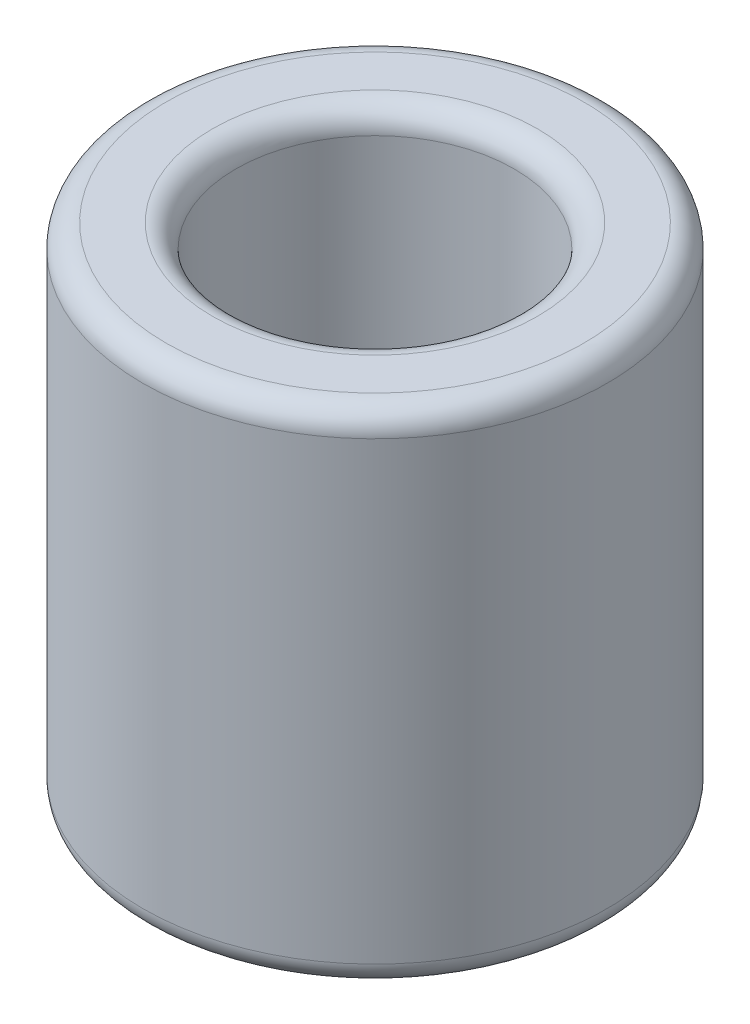
ISO-10303-21;
HEADER;
FILE_DESCRIPTION(('STEP AP214'),'2;1');
FILE_NAME('part.step','',(''),(''),'','','');
FILE_SCHEMA(('AUTOMOTIVE_DESIGN { 1 0 10303 214 1 1 1 1 }'));
ENDSEC;
DATA;
#1=APPLICATION_CONTEXT('core data for automotive mechanical design processes');
#2=APPLICATION_PROTOCOL_DEFINITION('international standard','automotive_design',2000,#1);
#3=PRODUCT_CONTEXT('',#1,'mechanical');
#4=PRODUCT('Part','Part','',(#3));
#5=PRODUCT_RELATED_PRODUCT_CATEGORY('part','',(#4));
#6=PRODUCT_DEFINITION_FORMATION('','',#4);
#7=PRODUCT_DEFINITION_CONTEXT('part definition',#1,'design');
#8=PRODUCT_DEFINITION('design','',#6,#7);
#9=PRODUCT_DEFINITION_SHAPE('','',#8);
#10=(LENGTH_UNIT() NAMED_UNIT(*) SI_UNIT(.MILLI.,.METRE.));
#11=(NAMED_UNIT(*) PLANE_ANGLE_UNIT() SI_UNIT($,.RADIAN.));
#12=(NAMED_UNIT(*) SI_UNIT($,.STERADIAN.) SOLID_ANGLE_UNIT());
#13=UNCERTAINTY_MEASURE_WITH_UNIT(LENGTH_MEASURE(1.E-05),#10,'distance_accuracy_value','');
#14=(GEOMETRIC_REPRESENTATION_CONTEXT(3) GLOBAL_UNCERTAINTY_ASSIGNED_CONTEXT((#13)) GLOBAL_UNIT_ASSIGNED_CONTEXT((#10,
#11,#12)) REPRESENTATION_CONTEXT('',''));
#15=CARTESIAN_POINT('',(0.,0.,0.));
#16=DIRECTION('',(0.,0.,1.));
#17=DIRECTION('',(1.,0.,0.));
#18=AXIS2_PLACEMENT_3D('',#15,#16,#17);
#19=CARTESIAN_POINT('',(0.,5.4,0.));
#20=DIRECTION('',(0.,1.,0.));
#21=DIRECTION('',(0.,0.,1.));
#22=AXIS2_PLACEMENT_3D('',#19,#20,#21);
#23=PLANE('',#22);
#24=CARTESIAN_POINT('',(0.,5.4,0.));
#25=DIRECTION('',(0.,1.,0.));
#26=DIRECTION('',(0.,0.,1.));
#27=AXIS2_PLACEMENT_3D('',#24,#25,#26);
#28=CIRCLE('',#27,1.75);
#29=CARTESIAN_POINT('',(0.,5.4,1.75));
#30=VERTEX_POINT('',#29);
#31=EDGE_CURVE('E43',#30,#30,#28,.F.);
#32=ORIENTED_EDGE('',*,*,#31,.T.);
#33=EDGE_LOOP('',(#32));
#34=FACE_BOUND('',#33,.T.);
#35=CARTESIAN_POINT('',(0.,5.4,0.));
#36=DIRECTION('',(0.,1.,0.));
#37=DIRECTION('',(0.,0.,1.));
#38=AXIS2_PLACEMENT_3D('',#35,#36,#37);
#39=CIRCLE('',#38,2.25);
#40=CARTESIAN_POINT('',(0.,5.4,2.25));
#41=VERTEX_POINT('',#40);
#42=EDGE_CURVE('E47',#41,#41,#39,.T.);
#43=ORIENTED_EDGE('',*,*,#42,.T.);
#44=EDGE_LOOP('',(#43));
#45=FACE_BOUND('',#44,.T.);
#46=ADVANCED_FACE('F32',(#34,#45),#23,.T.);
#47=CARTESIAN_POINT('',(0.,0.,0.));
#48=DIRECTION('',(0.,1.,0.));
#49=DIRECTION('',(0.,0.,1.));
#50=AXIS2_PLACEMENT_3D('',#47,#48,#49);
#51=PLANE('',#50);
#52=CARTESIAN_POINT('',(0.,0.,0.));
#53=DIRECTION('',(0.,1.,0.));
#54=DIRECTION('',(0.,0.,1.));
#55=AXIS2_PLACEMENT_3D('',#52,#53,#54);
#56=CIRCLE('',#55,1.75);
#57=CARTESIAN_POINT('',(0.,0.,1.75));
#58=VERTEX_POINT('',#57);
#59=EDGE_CURVE('E58',#58,#58,#56,.T.);
#60=ORIENTED_EDGE('',*,*,#59,.T.);
#61=EDGE_LOOP('',(#60));
#62=FACE_BOUND('',#61,.T.);
#63=CARTESIAN_POINT('',(0.,0.,0.));
#64=DIRECTION('',(0.,1.,0.));
#65=DIRECTION('',(0.,0.,1.));
#66=AXIS2_PLACEMENT_3D('',#63,#64,#65);
#67=CIRCLE('',#66,2.25);
#68=CARTESIAN_POINT('',(0.,0.,2.25));
#69=VERTEX_POINT('',#68);
#70=EDGE_CURVE('E61',#69,#69,#67,.F.);
#71=ORIENTED_EDGE('',*,*,#70,.T.);
#72=EDGE_LOOP('',(#71));
#73=FACE_BOUND('',#72,.T.);
#74=ADVANCED_FACE('F65',(#62,#73),#51,.F.);
#75=CARTESIAN_POINT('',(0.,5.4,0.));
#76=DIRECTION('',(0.,-1.,0.));
#77=DIRECTION('',(0.,0.,-1.));
#78=AXIS2_PLACEMENT_3D('',#75,#76,#77);
#79=CYLINDRICAL_SURFACE('',#78,2.5);
#80=CARTESIAN_POINT('',(0.,0.25,0.));
#81=DIRECTION('',(0.,1.,0.));
#82=DIRECTION('',(0.,0.,1.));
#83=AXIS2_PLACEMENT_3D('',#80,#81,#82);
#84=CIRCLE('',#83,2.5);
#85=CARTESIAN_POINT('',(0.,0.249999999999999,-2.5));
#86=VERTEX_POINT('',#85);
#87=EDGE_CURVE('E10',#86,#86,#84,.T.);
#88=CARTESIAN_POINT('',(0.,5.15,0.));
#89=DIRECTION('',(0.,1.,0.));
#90=DIRECTION('',(0.,0.,1.));
#91=AXIS2_PLACEMENT_3D('',#88,#89,#90);
#92=CIRCLE('',#91,2.5);
#93=CARTESIAN_POINT('',(0.,5.15,-2.5));
#94=VERTEX_POINT('',#93);
#95=EDGE_CURVE('E39',#94,#94,#92,.F.);
#96=CARTESIAN_POINT('',(0.,0.249999999999999,-2.5));
#97=CARTESIAN_POINT('',(0.,0.301041666666666,-2.5));
#98=CARTESIAN_POINT('',(0.,0.352083333333332,-2.5));
#99=CARTESIAN_POINT('',(0.,0.454166666666666,-2.5));
#100=CARTESIAN_POINT('',(0.,0.505208333333333,-2.5));
#101=CARTESIAN_POINT('',(0.,0.607291666666666,-2.5));
#102=CARTESIAN_POINT('',(0.,0.658333333333333,-2.5));
#103=CARTESIAN_POINT('',(0.,0.760416666666666,-2.5));
#104=CARTESIAN_POINT('',(0.,0.811458333333333,-2.5));
#105=CARTESIAN_POINT('',(0.,0.913541666666666,-2.5));
#106=CARTESIAN_POINT('',(0.,0.964583333333333,-2.5));
#107=CARTESIAN_POINT('',(0.,1.06666666666667,-2.5));
#108=CARTESIAN_POINT('',(0.,1.11770833333333,-2.5));
#109=CARTESIAN_POINT('',(0.,1.21979166666667,-2.5));
#110=CARTESIAN_POINT('',(0.,1.27083333333333,-2.5));
#111=CARTESIAN_POINT('',(0.,1.37291666666667,-2.5));
#112=CARTESIAN_POINT('',(0.,1.42395833333333,-2.5));
#113=CARTESIAN_POINT('',(0.,1.52604166666667,-2.5));
#114=CARTESIAN_POINT('',(0.,1.57708333333333,-2.5));
#115=CARTESIAN_POINT('',(0.,1.67916666666667,-2.5));
#116=CARTESIAN_POINT('',(0.,1.73020833333333,-2.5));
#117=CARTESIAN_POINT('',(0.,1.83229166666667,-2.5));
#118=CARTESIAN_POINT('',(0.,1.88333333333333,-2.5));
#119=CARTESIAN_POINT('',(0.,1.98541666666667,-2.5));
#120=CARTESIAN_POINT('',(0.,2.03645833333333,-2.5));
#121=CARTESIAN_POINT('',(0.,2.13854166666667,-2.5));
#122=CARTESIAN_POINT('',(0.,2.18958333333333,-2.5));
#123=CARTESIAN_POINT('',(0.,2.29166666666667,-2.5));
#124=CARTESIAN_POINT('',(0.,2.34270833333333,-2.5));
#125=CARTESIAN_POINT('',(0.,2.44479166666667,-2.5));
#126=CARTESIAN_POINT('',(0.,2.49583333333333,-2.5));
#127=CARTESIAN_POINT('',(0.,2.59791666666667,-2.5));
#128=CARTESIAN_POINT('',(0.,2.64895833333333,-2.5));
#129=CARTESIAN_POINT('',(0.,2.75104166666667,-2.5));
#130=CARTESIAN_POINT('',(0.,2.80208333333333,-2.5));
#131=CARTESIAN_POINT('',(0.,2.90416666666667,-2.5));
#132=CARTESIAN_POINT('',(0.,2.95520833333333,-2.5));
#133=CARTESIAN_POINT('',(0.,3.05729166666667,-2.5));
#134=CARTESIAN_POINT('',(0.,3.10833333333333,-2.5));
#135=CARTESIAN_POINT('',(0.,3.21041666666667,-2.5));
#136=CARTESIAN_POINT('',(0.,3.26145833333333,-2.5));
#137=CARTESIAN_POINT('',(0.,3.36354166666667,-2.5));
#138=CARTESIAN_POINT('',(0.,3.41458333333333,-2.5));
#139=CARTESIAN_POINT('',(0.,3.51666666666667,-2.5));
#140=CARTESIAN_POINT('',(0.,3.56770833333333,-2.5));
#141=CARTESIAN_POINT('',(0.,3.66979166666667,-2.5));
#142=CARTESIAN_POINT('',(0.,3.72083333333333,-2.5));
#143=CARTESIAN_POINT('',(0.,3.82291666666667,-2.5));
#144=CARTESIAN_POINT('',(0.,3.87395833333333,-2.5));
#145=CARTESIAN_POINT('',(0.,3.97604166666667,-2.5));
#146=CARTESIAN_POINT('',(0.,4.02708333333333,-2.5));
#147=CARTESIAN_POINT('',(0.,4.12916666666667,-2.5));
#148=CARTESIAN_POINT('',(0.,4.18020833333333,-2.5));
#149=CARTESIAN_POINT('',(0.,4.28229166666667,-2.5));
#150=CARTESIAN_POINT('',(0.,4.33333333333333,-2.5));
#151=CARTESIAN_POINT('',(0.,4.43541666666667,-2.5));
#152=CARTESIAN_POINT('',(0.,4.48645833333333,-2.5));
#153=CARTESIAN_POINT('',(0.,4.58854166666667,-2.5));
#154=CARTESIAN_POINT('',(0.,4.63958333333333,-2.5));
#155=CARTESIAN_POINT('',(0.,4.74166666666667,-2.5));
#156=CARTESIAN_POINT('',(0.,4.79270833333333,-2.5));
#157=CARTESIAN_POINT('',(0.,4.89479166666667,-2.5));
#158=CARTESIAN_POINT('',(0.,4.94583333333333,-2.5));
#159=CARTESIAN_POINT('',(0.,5.04791666666667,-2.5));
#160=CARTESIAN_POINT('',(0.,5.09895833333333,-2.5));
#161=CARTESIAN_POINT('',(0.,5.15,-2.5));
#162=B_SPLINE_CURVE_WITH_KNOTS('',3,(#96,#97,#98,#99,#100,#101,#102,#103,#104,#105,#106,#107,
#108,#109,#110,#111,#112,#113,#114,#115,#116,#117,#118,#119,#120,#121,#122,#123,#124,#125,#126,
#127,#128,#129,#130,#131,#132,#133,#134,#135,#136,#137,#138,#139,#140,#141,#142,#143,#144,#145,
#146,#147,#148,#149,#150,#151,#152,#153,#154,#155,#156,#157,#158,#159,#160,#161),.UNSPECIFIED.,
.F.,.F.,(4,2,2,2,2,2,2,2,2,2,2,2,2,2,2,2,2,2,2,2,2,2,2,2,2,2,2,2,2,2,2,2,4),(0.,0.153125,
0.30625,0.459375,0.6125,0.765625,0.91875,1.071875,1.225,1.378125,1.53125,1.684375,1.8375,
1.990625,2.14375,2.296875,2.45,2.603125,2.75625,2.909375,3.0625,3.215625,3.36875,3.521875,3.675,
3.828125,3.98125,4.134375,4.2875,4.440625,4.59375,4.746875,4.9),.UNSPECIFIED.);
#163=EDGE_CURVE('BSEAM85',#86,#94,#162,.T.);
#164=ORIENTED_EDGE('',*,*,#87,.T.);
#165=ORIENTED_EDGE('',*,*,#95,.T.);
#166=ORIENTED_EDGE('',*,*,#163,.T.);
#167=ORIENTED_EDGE('',*,*,#163,.F.);
#168=EDGE_LOOP('',(#164,#166,#165,#167));
#169=FACE_BOUND('',#168,.T.);
#170=ADVANCED_FACE('F85',(#169),#79,.T.);
#171=CARTESIAN_POINT('',(0.,5.4,0.));
#172=DIRECTION('',(0.,-1.,0.));
#173=DIRECTION('',(0.,0.,-1.));
#174=AXIS2_PLACEMENT_3D('',#171,#172,#173);
#175=CYLINDRICAL_SURFACE('',#174,1.5);
#176=CARTESIAN_POINT('',(0.,0.25,0.));
#177=DIRECTION('',(0.,1.,0.));
#178=DIRECTION('',(0.,0.,1.));
#179=AXIS2_PLACEMENT_3D('',#176,#177,#178);
#180=CIRCLE('',#179,1.5);
#181=CARTESIAN_POINT('',(0.,0.249999999999999,-1.5));
#182=VERTEX_POINT('',#181);
#183=EDGE_CURVE('E52',#182,#182,#180,.F.);
#184=CARTESIAN_POINT('',(0.,5.15,0.));
#185=DIRECTION('',(0.,1.,0.));
#186=DIRECTION('',(0.,0.,1.));
#187=AXIS2_PLACEMENT_3D('',#184,#185,#186);
#188=CIRCLE('',#187,1.5);
#189=CARTESIAN_POINT('',(0.,5.15,-1.5));
#190=VERTEX_POINT('',#189);
#191=EDGE_CURVE('E55',#190,#190,#188,.T.);
#192=CARTESIAN_POINT('',(0.,0.249999999999999,-1.5));
#193=CARTESIAN_POINT('',(0.,0.301041666666666,-1.5));
#194=CARTESIAN_POINT('',(0.,0.352083333333332,-1.5));
#195=CARTESIAN_POINT('',(0.,0.454166666666666,-1.5));
#196=CARTESIAN_POINT('',(0.,0.505208333333333,-1.5));
#197=CARTESIAN_POINT('',(0.,0.607291666666666,-1.5));
#198=CARTESIAN_POINT('',(0.,0.658333333333333,-1.5));
#199=CARTESIAN_POINT('',(0.,0.760416666666666,-1.5));
#200=CARTESIAN_POINT('',(0.,0.811458333333333,-1.5));
#201=CARTESIAN_POINT('',(0.,0.913541666666666,-1.5));
#202=CARTESIAN_POINT('',(0.,0.964583333333333,-1.5));
#203=CARTESIAN_POINT('',(0.,1.06666666666667,-1.5));
#204=CARTESIAN_POINT('',(0.,1.11770833333333,-1.5));
#205=CARTESIAN_POINT('',(0.,1.21979166666667,-1.5));
#206=CARTESIAN_POINT('',(0.,1.27083333333333,-1.5));
#207=CARTESIAN_POINT('',(0.,1.37291666666667,-1.5));
#208=CARTESIAN_POINT('',(0.,1.42395833333333,-1.5));
#209=CARTESIAN_POINT('',(0.,1.52604166666667,-1.5));
#210=CARTESIAN_POINT('',(0.,1.57708333333333,-1.5));
#211=CARTESIAN_POINT('',(0.,1.67916666666667,-1.5));
#212=CARTESIAN_POINT('',(0.,1.73020833333333,-1.5));
#213=CARTESIAN_POINT('',(0.,1.83229166666667,-1.5));
#214=CARTESIAN_POINT('',(0.,1.88333333333333,-1.5));
#215=CARTESIAN_POINT('',(0.,1.98541666666667,-1.5));
#216=CARTESIAN_POINT('',(0.,2.03645833333333,-1.5));
#217=CARTESIAN_POINT('',(0.,2.13854166666667,-1.5));
#218=CARTESIAN_POINT('',(0.,2.18958333333333,-1.5));
#219=CARTESIAN_POINT('',(0.,2.29166666666667,-1.5));
#220=CARTESIAN_POINT('',(0.,2.34270833333333,-1.5));
#221=CARTESIAN_POINT('',(0.,2.44479166666667,-1.5));
#222=CARTESIAN_POINT('',(0.,2.49583333333333,-1.5));
#223=CARTESIAN_POINT('',(0.,2.59791666666667,-1.5));
#224=CARTESIAN_POINT('',(0.,2.64895833333333,-1.5));
#225=CARTESIAN_POINT('',(0.,2.75104166666667,-1.5));
#226=CARTESIAN_POINT('',(0.,2.80208333333333,-1.5));
#227=CARTESIAN_POINT('',(0.,2.90416666666667,-1.5));
#228=CARTESIAN_POINT('',(0.,2.95520833333333,-1.5));
#229=CARTESIAN_POINT('',(0.,3.05729166666667,-1.5));
#230=CARTESIAN_POINT('',(0.,3.10833333333333,-1.5));
#231=CARTESIAN_POINT('',(0.,3.21041666666667,-1.5));
#232=CARTESIAN_POINT('',(0.,3.26145833333333,-1.5));
#233=CARTESIAN_POINT('',(0.,3.36354166666667,-1.5));
#234=CARTESIAN_POINT('',(0.,3.41458333333333,-1.5));
#235=CARTESIAN_POINT('',(0.,3.51666666666667,-1.5));
#236=CARTESIAN_POINT('',(0.,3.56770833333333,-1.5));
#237=CARTESIAN_POINT('',(0.,3.66979166666667,-1.5));
#238=CARTESIAN_POINT('',(0.,3.72083333333333,-1.5));
#239=CARTESIAN_POINT('',(0.,3.82291666666667,-1.5));
#240=CARTESIAN_POINT('',(0.,3.87395833333333,-1.5));
#241=CARTESIAN_POINT('',(0.,3.97604166666667,-1.5));
#242=CARTESIAN_POINT('',(0.,4.02708333333333,-1.5));
#243=CARTESIAN_POINT('',(0.,4.12916666666667,-1.5));
#244=CARTESIAN_POINT('',(0.,4.18020833333333,-1.5));
#245=CARTESIAN_POINT('',(0.,4.28229166666667,-1.5));
#246=CARTESIAN_POINT('',(0.,4.33333333333333,-1.5));
#247=CARTESIAN_POINT('',(0.,4.43541666666667,-1.5));
#248=CARTESIAN_POINT('',(0.,4.48645833333333,-1.5));
#249=CARTESIAN_POINT('',(0.,4.58854166666667,-1.5));
#250=CARTESIAN_POINT('',(0.,4.63958333333333,-1.5));
#251=CARTESIAN_POINT('',(0.,4.74166666666667,-1.5));
#252=CARTESIAN_POINT('',(0.,4.79270833333333,-1.5));
#253=CARTESIAN_POINT('',(0.,4.89479166666667,-1.5));
#254=CARTESIAN_POINT('',(0.,4.94583333333333,-1.5));
#255=CARTESIAN_POINT('',(0.,5.04791666666667,-1.5));
#256=CARTESIAN_POINT('',(0.,5.09895833333333,-1.5));
#257=CARTESIAN_POINT('',(0.,5.15,-1.5));
#258=B_SPLINE_CURVE_WITH_KNOTS('',3,(#192,#193,#194,#195,#196,#197,#198,#199,#200,#201,#202,
#203,#204,#205,#206,#207,#208,#209,#210,#211,#212,#213,#214,#215,#216,#217,#218,#219,#220,#221,
#222,#223,#224,#225,#226,#227,#228,#229,#230,#231,#232,#233,#234,#235,#236,#237,#238,#239,#240,
#241,#242,#243,#244,#245,#246,#247,#248,#249,#250,#251,#252,#253,#254,#255,#256,#257),
.UNSPECIFIED.,.F.,.F.,(4,2,2,2,2,2,2,2,2,2,2,2,2,2,2,2,2,2,2,2,2,2,2,2,2,2,2,2,2,2,2,2,4),(0.,
0.153125,0.30625,0.459375,0.6125,0.765625,0.91875,1.071875,1.225,1.378125,1.53125,1.684375,
1.8375,1.990625,2.14375,2.296875,2.45,2.603125,2.75625,2.909375,3.0625,3.215625,3.36875,
3.521875,3.675,3.828125,3.98125,4.134375,4.2875,4.440625,4.59375,4.746875,4.9),.UNSPECIFIED.);
#259=EDGE_CURVE('BSEAM90',#182,#190,#258,.T.);
#260=ORIENTED_EDGE('',*,*,#183,.T.);
#261=ORIENTED_EDGE('',*,*,#191,.T.);
#262=ORIENTED_EDGE('',*,*,#259,.T.);
#263=ORIENTED_EDGE('',*,*,#259,.F.);
#264=EDGE_LOOP('',(#260,#262,#261,#263));
#265=FACE_BOUND('',#264,.T.);
#266=ADVANCED_FACE('F90',(#265),#175,.F.);
#267=CARTESIAN_POINT('',(0.,0.25,0.));
#268=DIRECTION('',(0.,1.,0.));
#269=DIRECTION('',(0.,0.,1.));
#270=AXIS2_PLACEMENT_3D('',#267,#268,#269);
#271=TOROIDAL_SURFACE('',#270,1.75,0.25);
#272=ORIENTED_EDGE('',*,*,#183,.F.);
#273=EDGE_LOOP('',(#272));
#274=FACE_BOUND('',#273,.T.);
#275=ORIENTED_EDGE('',*,*,#59,.F.);
#276=EDGE_LOOP('',(#275));
#277=FACE_BOUND('',#276,.T.);
#278=ADVANCED_FACE('F76',(#274,#277),#271,.T.);
#279=CARTESIAN_POINT('',(0.,5.15,0.));
#280=DIRECTION('',(0.,1.,0.));
#281=DIRECTION('',(0.,0.,1.));
#282=AXIS2_PLACEMENT_3D('',#279,#280,#281);
#283=TOROIDAL_SURFACE('',#282,1.75,0.25);
#284=ORIENTED_EDGE('',*,*,#31,.F.);
#285=EDGE_LOOP('',(#284));
#286=FACE_BOUND('',#285,.T.);
#287=ORIENTED_EDGE('',*,*,#191,.F.);
#288=EDGE_LOOP('',(#287));
#289=FACE_BOUND('',#288,.T.);
#290=ADVANCED_FACE('F70',(#286,#289),#283,.T.);
#291=CARTESIAN_POINT('',(0.,0.25,0.));
#292=DIRECTION('',(0.,1.,0.));
#293=DIRECTION('',(0.,0.,1.));
#294=AXIS2_PLACEMENT_3D('',#291,#292,#293);
#295=TOROIDAL_SURFACE('',#294,2.25,0.25);
#296=ORIENTED_EDGE('',*,*,#70,.F.);
#297=EDGE_LOOP('',(#296));
#298=FACE_BOUND('',#297,.T.);
#299=ORIENTED_EDGE('',*,*,#87,.F.);
#300=EDGE_LOOP('',(#299));
#301=FACE_BOUND('',#300,.T.);
#302=ADVANCED_FACE('F67',(#298,#301),#295,.T.);
#303=CARTESIAN_POINT('',(0.,5.15,0.));
#304=DIRECTION('',(0.,1.,0.));
#305=DIRECTION('',(0.,0.,1.));
#306=AXIS2_PLACEMENT_3D('',#303,#304,#305);
#307=TOROIDAL_SURFACE('',#306,2.25,0.25);
#308=ORIENTED_EDGE('',*,*,#95,.F.);
#309=EDGE_LOOP('',(#308));
#310=FACE_BOUND('',#309,.T.);
#311=ORIENTED_EDGE('',*,*,#42,.F.);
#312=EDGE_LOOP('',(#311));
#313=FACE_BOUND('',#312,.T.);
#314=ADVANCED_FACE('F34',(#310,#313),#307,.T.);
#315=CLOSED_SHELL('',(#46,#74,#170,#266,#278,#290,#302,#314));
#316=MANIFOLD_SOLID_BREP('B2',#315);
#317=ADVANCED_BREP_SHAPE_REPRESENTATION('',(#18,#316),#14);
#318=SHAPE_DEFINITION_REPRESENTATION(#9,#317);
ENDSEC;
END-ISO-10303-21;
